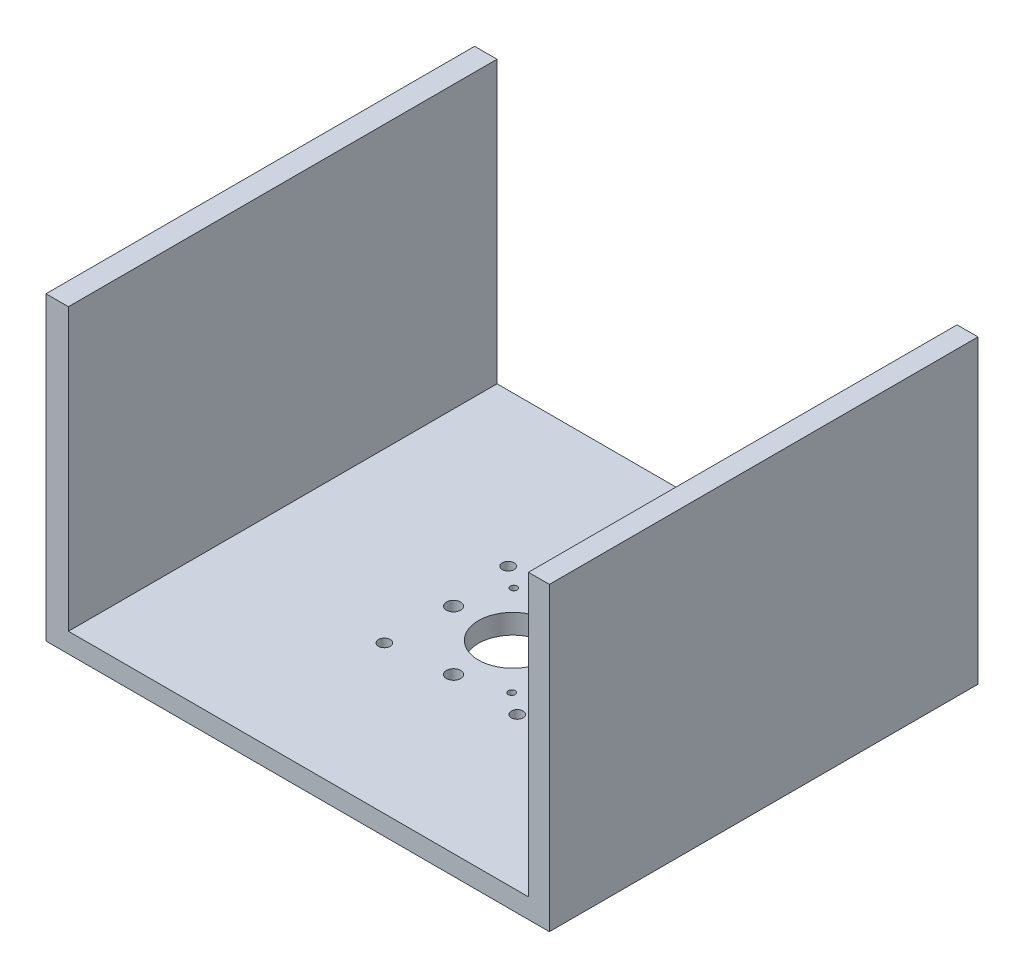
ISO-10303-21;
HEADER;
FILE_DESCRIPTION(('STEP AP214'),'2;1');
FILE_NAME('part.step','',(''),(''),'','','');
FILE_SCHEMA(('AUTOMOTIVE_DESIGN { 1 0 10303 214 1 1 1 1 }'));
ENDSEC;
DATA;
#1=APPLICATION_CONTEXT('core data for automotive mechanical design processes');
#2=APPLICATION_PROTOCOL_DEFINITION('international standard','automotive_design',2000,#1);
#3=PRODUCT_CONTEXT('',#1,'mechanical');
#4=PRODUCT('Part','Part','',(#3));
#5=PRODUCT_RELATED_PRODUCT_CATEGORY('part','',(#4));
#6=PRODUCT_DEFINITION_FORMATION('','',#4);
#7=PRODUCT_DEFINITION_CONTEXT('part definition',#1,'design');
#8=PRODUCT_DEFINITION('design','',#6,#7);
#9=PRODUCT_DEFINITION_SHAPE('','',#8);
#10=(LENGTH_UNIT() NAMED_UNIT(*) SI_UNIT(.MILLI.,.METRE.));
#11=(NAMED_UNIT(*) PLANE_ANGLE_UNIT() SI_UNIT($,.RADIAN.));
#12=(NAMED_UNIT(*) SI_UNIT($,.STERADIAN.) SOLID_ANGLE_UNIT());
#13=UNCERTAINTY_MEASURE_WITH_UNIT(LENGTH_MEASURE(1.E-05),#10,'distance_accuracy_value','');
#14=(GEOMETRIC_REPRESENTATION_CONTEXT(3) GLOBAL_UNCERTAINTY_ASSIGNED_CONTEXT((#13)) GLOBAL_UNIT_ASSIGNED_CONTEXT((#10,
#11,#12)) REPRESENTATION_CONTEXT('',''));
#15=CARTESIAN_POINT('',(0.,0.,0.));
#16=DIRECTION('',(0.,0.,1.));
#17=DIRECTION('',(1.,0.,0.));
#18=AXIS2_PLACEMENT_3D('',#15,#16,#17);
#19=CARTESIAN_POINT('',(0.,76.2,-54.2873346592199));
#20=DIRECTION('',(0.,0.,1.));
#21=DIRECTION('',(1.,0.,0.));
#22=AXIS2_PLACEMENT_3D('',#19,#20,#21);
#23=PLANE('',#22);
#24=DIRECTION('',(-1.,0.,0.));
#25=VECTOR('',#24,1.);
#26=CARTESIAN_POINT('',(0.,0.,-54.2873346592199));
#27=LINE('',#26,#25);
#28=CARTESIAN_POINT('',(63.5667694033076,0.,-54.2873346592199));
#29=VERTEX_POINT('',#28);
#30=CARTESIAN_POINT('',(-63.9431332259104,0.,-54.2873346592199));
#31=VERTEX_POINT('',#30);
#32=EDGE_CURVE('E218',#29,#31,#27,.T.);
#33=ORIENTED_EDGE('',*,*,#32,.T.);
#34=DIRECTION('',(0.,-1.,0.));
#35=VECTOR('',#34,1.);
#36=CARTESIAN_POINT('',(-63.9431332259104,76.2,-54.2873346592199));
#37=LINE('',#36,#35);
#38=CARTESIAN_POINT('',(-63.9431332259104,76.2,-54.2873346592199));
#39=VERTEX_POINT('',#38);
#40=EDGE_CURVE('E11',#39,#31,#37,.T.);
#41=ORIENTED_EDGE('',*,*,#40,.F.);
#42=DIRECTION('',(-1.,0.,0.));
#43=VECTOR('',#42,1.);
#44=CARTESIAN_POINT('',(0.,76.2,-54.2873346592199));
#45=LINE('',#44,#43);
#46=CARTESIAN_POINT('',(-58.259578658675,76.2,-54.2873346592199));
#47=VERTEX_POINT('',#46);
#48=EDGE_CURVE('E261',#47,#39,#45,.T.);
#49=ORIENTED_EDGE('',*,*,#48,.F.);
#50=DIRECTION('',(0.,-1.,0.));
#51=VECTOR('',#50,1.);
#52=CARTESIAN_POINT('',(-58.259578658675,76.2,-54.2873346592199));
#53=LINE('',#52,#51);
#54=CARTESIAN_POINT('',(-58.259578658675,5.00000000000003,-54.2873346592199));
#55=VERTEX_POINT('',#54);
#56=EDGE_CURVE('E272',#47,#55,#53,.T.);
#57=ORIENTED_EDGE('',*,*,#56,.T.);
#58=DIRECTION('',(1.,0.,0.));
#59=VECTOR('',#58,1.);
#60=CARTESIAN_POINT('',(0.,5.,-54.2873346592199));
#61=LINE('',#60,#59);
#62=CARTESIAN_POINT('',(58.259578658675,5.,-54.2873346592199));
#63=VERTEX_POINT('',#62);
#64=EDGE_CURVE('E56',#55,#63,#61,.T.);
#65=ORIENTED_EDGE('',*,*,#64,.T.);
#66=DIRECTION('',(0.,-1.,0.));
#67=VECTOR('',#66,1.);
#68=CARTESIAN_POINT('',(58.259578658675,76.2,-54.2873346592199));
#69=LINE('',#68,#67);
#70=CARTESIAN_POINT('',(58.259578658675,76.2,-54.2873346592199));
#71=VERTEX_POINT('',#70);
#72=EDGE_CURVE('E129',#71,#63,#69,.T.);
#73=ORIENTED_EDGE('',*,*,#72,.F.);
#74=DIRECTION('',(1.,0.,0.));
#75=VECTOR('',#74,1.);
#76=CARTESIAN_POINT('',(0.,76.2,-54.2873346592199));
#77=LINE('',#76,#75);
#78=CARTESIAN_POINT('',(63.5667694033076,76.2,-54.2873346592199));
#79=VERTEX_POINT('',#78);
#80=EDGE_CURVE('E135',#71,#79,#77,.T.);
#81=ORIENTED_EDGE('',*,*,#80,.T.);
#82=DIRECTION('',(0.,-1.,0.));
#83=VECTOR('',#82,1.);
#84=CARTESIAN_POINT('',(63.5667694033076,76.2,-54.2873346592199));
#85=LINE('',#84,#83);
#86=EDGE_CURVE('E117',#79,#29,#85,.T.);
#87=ORIENTED_EDGE('',*,*,#86,.T.);
#88=EDGE_LOOP('',(#33,#41,#49,#57,#65,#73,#81,#87));
#89=FACE_BOUND('',#88,.T.);
#90=ADVANCED_FACE('F41',(#89),#23,.F.);
#91=CARTESIAN_POINT('',(-63.9431332259104,76.2,0.));
#92=DIRECTION('',(1.,0.,0.));
#93=DIRECTION('',(0.,0.,-1.));
#94=AXIS2_PLACEMENT_3D('',#91,#92,#93);
#95=PLANE('',#94);
#96=DIRECTION('',(0.,0.,1.));
#97=VECTOR('',#96,1.);
#98=CARTESIAN_POINT('',(-63.9431332259104,0.,0.));
#99=LINE('',#98,#97);
#100=CARTESIAN_POINT('',(-63.9431332259104,0.,54.2873346592199));
#101=VERTEX_POINT('',#100);
#102=EDGE_CURVE('E275',#31,#101,#99,.T.);
#103=ORIENTED_EDGE('',*,*,#102,.T.);
#104=DIRECTION('',(0.,-1.,0.));
#105=VECTOR('',#104,1.);
#106=CARTESIAN_POINT('',(-63.9431332259104,76.2,54.2873346592199));
#107=LINE('',#106,#105);
#108=CARTESIAN_POINT('',(-63.9431332259104,76.2,54.2873346592199));
#109=VERTEX_POINT('',#108);
#110=EDGE_CURVE('E49',#109,#101,#107,.T.);
#111=ORIENTED_EDGE('',*,*,#110,.F.);
#112=DIRECTION('',(0.,0.,1.));
#113=VECTOR('',#112,1.);
#114=CARTESIAN_POINT('',(-63.9431332259104,76.2,0.));
#115=LINE('',#114,#113);
#116=EDGE_CURVE('E87',#39,#109,#115,.T.);
#117=ORIENTED_EDGE('',*,*,#116,.F.);
#118=ORIENTED_EDGE('',*,*,#40,.T.);
#119=EDGE_LOOP('',(#103,#111,#117,#118));
#120=FACE_BOUND('',#119,.T.);
#121=ADVANCED_FACE('F311',(#120),#95,.F.);
#122=CARTESIAN_POINT('',(0.,76.2,54.2873346592199));
#123=DIRECTION('',(0.,0.,1.));
#124=DIRECTION('',(1.,0.,0.));
#125=AXIS2_PLACEMENT_3D('',#122,#123,#124);
#126=PLANE('',#125);
#127=DIRECTION('',(-1.,0.,0.));
#128=VECTOR('',#127,1.);
#129=CARTESIAN_POINT('',(0.,0.,54.2873346592199));
#130=LINE('',#129,#128);
#131=CARTESIAN_POINT('',(63.5667694033076,0.,54.2873346592199));
#132=VERTEX_POINT('',#131);
#133=EDGE_CURVE('E264',#132,#101,#130,.T.);
#134=ORIENTED_EDGE('',*,*,#133,.F.);
#135=DIRECTION('',(0.,-1.,0.));
#136=VECTOR('',#135,1.);
#137=CARTESIAN_POINT('',(63.5667694033076,76.2,54.2873346592199));
#138=LINE('',#137,#136);
#139=CARTESIAN_POINT('',(63.5667694033076,76.2,54.2873346592199));
#140=VERTEX_POINT('',#139);
#141=EDGE_CURVE('E150',#140,#132,#138,.T.);
#142=ORIENTED_EDGE('',*,*,#141,.F.);
#143=DIRECTION('',(1.,0.,0.));
#144=VECTOR('',#143,1.);
#145=CARTESIAN_POINT('',(0.,76.2,54.2873346592199));
#146=LINE('',#145,#144);
#147=CARTESIAN_POINT('',(58.259578658675,76.2,54.2873346592199));
#148=VERTEX_POINT('',#147);
#149=EDGE_CURVE('E138',#148,#140,#146,.T.);
#150=ORIENTED_EDGE('',*,*,#149,.F.);
#151=DIRECTION('',(0.,-1.,0.));
#152=VECTOR('',#151,1.);
#153=CARTESIAN_POINT('',(58.259578658675,76.2,54.2873346592199));
#154=LINE('',#153,#152);
#155=CARTESIAN_POINT('',(58.259578658675,5.00000000000003,54.2873346592199));
#156=VERTEX_POINT('',#155);
#157=EDGE_CURVE('E155',#148,#156,#154,.T.);
#158=ORIENTED_EDGE('',*,*,#157,.T.);
#159=DIRECTION('',(1.,0.,0.));
#160=VECTOR('',#159,1.);
#161=CARTESIAN_POINT('',(0.,5.,54.2873346592199));
#162=LINE('',#161,#160);
#163=CARTESIAN_POINT('',(-58.259578658675,5.,54.2873346592199));
#164=VERTEX_POINT('',#163);
#165=EDGE_CURVE('E206',#164,#156,#162,.T.);
#166=ORIENTED_EDGE('',*,*,#165,.F.);
#167=DIRECTION('',(0.,-1.,0.));
#168=VECTOR('',#167,1.);
#169=CARTESIAN_POINT('',(-58.259578658675,76.2,54.2873346592199));
#170=LINE('',#169,#168);
#171=CARTESIAN_POINT('',(-58.259578658675,76.2,54.2873346592199));
#172=VERTEX_POINT('',#171);
#173=EDGE_CURVE('E284',#172,#164,#170,.T.);
#174=ORIENTED_EDGE('',*,*,#173,.F.);
#175=DIRECTION('',(-1.,0.,0.));
#176=VECTOR('',#175,1.);
#177=CARTESIAN_POINT('',(0.,76.2,54.2873346592199));
#178=LINE('',#177,#176);
#179=EDGE_CURVE('E267',#172,#109,#178,.T.);
#180=ORIENTED_EDGE('',*,*,#179,.T.);
#181=ORIENTED_EDGE('',*,*,#110,.T.);
#182=EDGE_LOOP('',(#134,#142,#150,#158,#166,#174,#180,#181));
#183=FACE_BOUND('',#182,.T.);
#184=ADVANCED_FACE('F290',(#183),#126,.T.);
#185=CARTESIAN_POINT('',(-58.259578658675,76.2,0.));
#186=DIRECTION('',(-1.,0.,0.));
#187=DIRECTION('',(0.,0.,1.));
#188=AXIS2_PLACEMENT_3D('',#185,#186,#187);
#189=PLANE('',#188);
#190=ORIENTED_EDGE('',*,*,#173,.T.);
#191=DIRECTION('',(0.,0.,-1.));
#192=VECTOR('',#191,1.);
#193=CARTESIAN_POINT('',(-58.259578658675,5.,0.));
#194=LINE('',#193,#192);
#195=EDGE_CURVE('E215',#164,#55,#194,.T.);
#196=ORIENTED_EDGE('',*,*,#195,.T.);
#197=ORIENTED_EDGE('',*,*,#56,.F.);
#198=DIRECTION('',(0.,0.,-1.));
#199=VECTOR('',#198,1.);
#200=CARTESIAN_POINT('',(-58.259578658675,76.2,0.));
#201=LINE('',#200,#199);
#202=EDGE_CURVE('E65',#172,#47,#201,.T.);
#203=ORIENTED_EDGE('',*,*,#202,.F.);
#204=EDGE_LOOP('',(#190,#196,#197,#203));
#205=FACE_BOUND('',#204,.T.);
#206=ADVANCED_FACE('F289',(#205),#189,.F.);
#207=CARTESIAN_POINT('',(0.,76.2,0.));
#208=DIRECTION('',(0.,1.,0.));
#209=DIRECTION('',(0.,0.,1.));
#210=AXIS2_PLACEMENT_3D('',#207,#208,#209);
#211=PLANE('',#210);
#212=ORIENTED_EDGE('',*,*,#48,.T.);
#213=ORIENTED_EDGE('',*,*,#116,.T.);
#214=ORIENTED_EDGE('',*,*,#179,.F.);
#215=ORIENTED_EDGE('',*,*,#202,.T.);
#216=EDGE_LOOP('',(#212,#213,#214,#215));
#217=FACE_BOUND('',#216,.T.);
#218=ADVANCED_FACE('F322',(#217),#211,.T.);
#219=CARTESIAN_POINT('',(0.,0.,0.));
#220=DIRECTION('',(0.,1.,0.));
#221=DIRECTION('',(0.,0.,1.));
#222=AXIS2_PLACEMENT_3D('',#219,#220,#221);
#223=PLANE('',#222);
#224=ORIENTED_EDGE('',*,*,#32,.F.);
#225=DIRECTION('',(0.,0.,1.));
#226=VECTOR('',#225,1.);
#227=CARTESIAN_POINT('',(63.5667694033076,0.,0.));
#228=LINE('',#227,#226);
#229=EDGE_CURVE('E123',#29,#132,#228,.T.);
#230=ORIENTED_EDGE('',*,*,#229,.T.);
#231=ORIENTED_EDGE('',*,*,#133,.T.);
#232=ORIENTED_EDGE('',*,*,#102,.F.);
#233=EDGE_LOOP('',(#224,#230,#231,#232));
#234=FACE_BOUND('',#233,.T.);
#235=CARTESIAN_POINT('',(0.,0.,0.));
#236=DIRECTION('',(0.,1.,0.));
#237=DIRECTION('',(0.,0.,1.));
#238=AXIS2_PLACEMENT_3D('',#235,#236,#237);
#239=CIRCLE('',#238,8.6768437);
#240=CARTESIAN_POINT('',(0.,0.,8.67684370000001));
#241=VERTEX_POINT('',#240);
#242=EDGE_CURVE('E128',#241,#241,#239,.T.);
#243=ORIENTED_EDGE('',*,*,#242,.T.);
#244=EDGE_LOOP('',(#243));
#245=FACE_BOUND('',#244,.T.);
#246=CARTESIAN_POINT('',(11.3281003312998,0.,11.6087270139325));
#247=DIRECTION('',(0.,1.,0.));
#248=DIRECTION('',(0.,0.,1.));
#249=AXIS2_PLACEMENT_3D('',#246,#247,#248);
#250=CIRCLE('',#249,0.875);
#251=CARTESIAN_POINT('',(11.3281003312998,0.,12.4837270139325));
#252=VERTEX_POINT('',#251);
#253=EDGE_CURVE('E222',#252,#252,#250,.T.);
#254=ORIENTED_EDGE('',*,*,#253,.T.);
#255=EDGE_LOOP('',(#254));
#256=FACE_BOUND('',#255,.T.);
#257=CARTESIAN_POINT('',(-11.3281003312988,0.,-11.6087270139334));
#258=DIRECTION('',(0.,1.,0.));
#259=DIRECTION('',(0.,0.,1.));
#260=AXIS2_PLACEMENT_3D('',#257,#258,#259);
#261=CIRCLE('',#260,0.875);
#262=CARTESIAN_POINT('',(-11.3281003312988,0.,-10.7337270139334));
#263=VERTEX_POINT('',#262);
#264=EDGE_CURVE('E226',#263,#263,#261,.T.);
#265=ORIENTED_EDGE('',*,*,#264,.T.);
#266=EDGE_LOOP('',(#265));
#267=FACE_BOUND('',#266,.T.);
#268=CARTESIAN_POINT('',(-15.6865060382862,0.,16.8342991630407));
#269=DIRECTION('',(0.,1.,0.));
#270=DIRECTION('',(0.,0.,1.));
#271=AXIS2_PLACEMENT_3D('',#268,#269,#270);
#272=CIRCLE('',#271,1.5);
#273=CARTESIAN_POINT('',(-15.6865060382862,0.,18.3342991630407));
#274=VERTEX_POINT('',#273);
#275=EDGE_CURVE('E230',#274,#274,#272,.T.);
#276=ORIENTED_EDGE('',*,*,#275,.T.);
#277=EDGE_LOOP('',(#276));
#278=FACE_BOUND('',#277,.T.);
#279=CARTESIAN_POINT('',(16.8342991630425,0.,15.6865060382861));
#280=DIRECTION('',(0.,1.,0.));
#281=DIRECTION('',(0.,0.,1.));
#282=AXIS2_PLACEMENT_3D('',#279,#280,#281);
#283=CIRCLE('',#282,1.5);
#284=CARTESIAN_POINT('',(16.8342991630425,0.,17.1865060382861));
#285=VERTEX_POINT('',#284);
#286=EDGE_CURVE('E234',#285,#285,#283,.T.);
#287=ORIENTED_EDGE('',*,*,#286,.T.);
#288=EDGE_LOOP('',(#287));
#289=FACE_BOUND('',#288,.T.);
#290=CARTESIAN_POINT('',(15.6865060382879,0.,-16.8342991630426));
#291=DIRECTION('',(0.,1.,0.));
#292=DIRECTION('',(0.,0.,1.));
#293=AXIS2_PLACEMENT_3D('',#290,#291,#292);
#294=CIRCLE('',#293,1.5);
#295=CARTESIAN_POINT('',(15.6865060382879,0.,-15.3342991630426));
#296=VERTEX_POINT('',#295);
#297=EDGE_CURVE('E238',#296,#296,#294,.T.);
#298=ORIENTED_EDGE('',*,*,#297,.T.);
#299=EDGE_LOOP('',(#298));
#300=FACE_BOUND('',#299,.T.);
#301=CARTESIAN_POINT('',(-16.8342991630408,0.,-15.686506038288));
#302=DIRECTION('',(0.,1.,0.));
#303=DIRECTION('',(0.,0.,1.));
#304=AXIS2_PLACEMENT_3D('',#301,#302,#303);
#305=CIRCLE('',#304,1.5);
#306=CARTESIAN_POINT('',(-16.8342991630408,0.,-14.186506038288));
#307=VERTEX_POINT('',#306);
#308=EDGE_CURVE('E242',#307,#307,#305,.T.);
#309=ORIENTED_EDGE('',*,*,#308,.T.);
#310=EDGE_LOOP('',(#309));
#311=FACE_BOUND('',#310,.T.);
#312=CARTESIAN_POINT('',(-14.9999999999992,0.,8.43789235357268E-13));
#313=DIRECTION('',(0.,1.,0.));
#314=DIRECTION('',(0.,0.,1.));
#315=AXIS2_PLACEMENT_3D('',#312,#313,#314);
#316=CIRCLE('',#315,1.8);
#317=CARTESIAN_POINT('',(-14.9999999999992,0.,1.80000000000084));
#318=VERTEX_POINT('',#317);
#319=EDGE_CURVE('E246',#318,#318,#316,.T.);
#320=ORIENTED_EDGE('',*,*,#319,.T.);
#321=EDGE_LOOP('',(#320));
#322=FACE_BOUND('',#321,.T.);
#323=CARTESIAN_POINT('',(1.69511304627905E-12,0.,15.));
#324=DIRECTION('',(0.,1.,0.));
#325=DIRECTION('',(0.,0.,1.));
#326=AXIS2_PLACEMENT_3D('',#323,#324,#325);
#327=CIRCLE('',#326,1.8);
#328=CARTESIAN_POINT('',(1.69511304627905E-12,0.,16.8));
#329=VERTEX_POINT('',#328);
#330=EDGE_CURVE('E250',#329,#329,#327,.T.);
#331=ORIENTED_EDGE('',*,*,#330,.T.);
#332=EDGE_LOOP('',(#331));
#333=FACE_BOUND('',#332,.T.);
#334=CARTESIAN_POINT('',(15.0000000000009,0.,-8.41952265158547E-13));
#335=DIRECTION('',(0.,1.,0.));
#336=DIRECTION('',(0.,0.,1.));
#337=AXIS2_PLACEMENT_3D('',#334,#335,#336);
#338=CIRCLE('',#337,1.8);
#339=CARTESIAN_POINT('',(15.0000000000009,0.,1.79999999999916));
#340=VERTEX_POINT('',#339);
#341=EDGE_CURVE('E254',#340,#340,#338,.T.);
#342=ORIENTED_EDGE('',*,*,#341,.T.);
#343=EDGE_LOOP('',(#342));
#344=FACE_BOUND('',#343,.T.);
#345=CARTESIAN_POINT('',(0.,0.,-15.));
#346=DIRECTION('',(0.,1.,0.));
#347=DIRECTION('',(0.,0.,1.));
#348=AXIS2_PLACEMENT_3D('',#345,#346,#347);
#349=CIRCLE('',#348,1.8);
#350=CARTESIAN_POINT('',(0.,0.,-13.2));
#351=VERTEX_POINT('',#350);
#352=EDGE_CURVE('E166',#351,#351,#349,.T.);
#353=ORIENTED_EDGE('',*,*,#352,.T.);
#354=EDGE_LOOP('',(#353));
#355=FACE_BOUND('',#354,.T.);
#356=ADVANCED_FACE('F323',(#234,#245,#256,#267,#278,#289,#300,#311,#322,#333,#344,#355),#223,.F.);
#357=CARTESIAN_POINT('',(0.,5.,-15.));
#358=DIRECTION('',(0.,-1.,0.));
#359=DIRECTION('',(0.,0.,-1.));
#360=AXIS2_PLACEMENT_3D('',#357,#358,#359);
#361=CYLINDRICAL_SURFACE('',#360,1.8);
#362=CARTESIAN_POINT('',(0.,5.,-15.));
#363=DIRECTION('',(0.,1.,0.));
#364=DIRECTION('',(0.,0.,1.));
#365=AXIS2_PLACEMENT_3D('',#362,#363,#364);
#366=CIRCLE('',#365,1.8);
#367=CARTESIAN_POINT('',(0.,5.,-13.2));
#368=VERTEX_POINT('',#367);
#369=EDGE_CURVE('E202',#368,#368,#366,.T.);
#370=ORIENTED_EDGE('',*,*,#369,.T.);
#371=EDGE_LOOP('',(#370));
#372=FACE_BOUND('',#371,.T.);
#373=ORIENTED_EDGE('',*,*,#352,.F.);
#374=EDGE_LOOP('',(#373));
#375=FACE_BOUND('',#374,.T.);
#376=ADVANCED_FACE('F326',(#372,#375),#361,.F.);
#377=CARTESIAN_POINT('',(15.0000000000009,5.,-8.41952265158547E-13));
#378=DIRECTION('',(0.,-1.,0.));
#379=DIRECTION('',(0.,0.,-1.));
#380=AXIS2_PLACEMENT_3D('',#377,#378,#379);
#381=CYLINDRICAL_SURFACE('',#380,1.8);
#382=CARTESIAN_POINT('',(15.0000000000009,5.,-8.41952265158547E-13));
#383=DIRECTION('',(0.,1.,0.));
#384=DIRECTION('',(0.,0.,1.));
#385=AXIS2_PLACEMENT_3D('',#382,#383,#384);
#386=CIRCLE('',#385,1.8);
#387=CARTESIAN_POINT('',(15.0000000000009,5.,1.79999999999916));
#388=VERTEX_POINT('',#387);
#389=EDGE_CURVE('E198',#388,#388,#386,.T.);
#390=ORIENTED_EDGE('',*,*,#389,.T.);
#391=EDGE_LOOP('',(#390));
#392=FACE_BOUND('',#391,.T.);
#393=ORIENTED_EDGE('',*,*,#341,.F.);
#394=EDGE_LOOP('',(#393));
#395=FACE_BOUND('',#394,.T.);
#396=ADVANCED_FACE('F360',(#392,#395),#381,.F.);
#397=CARTESIAN_POINT('',(1.69511304627905E-12,5.,15.));
#398=DIRECTION('',(0.,-1.,0.));
#399=DIRECTION('',(0.,0.,-1.));
#400=AXIS2_PLACEMENT_3D('',#397,#398,#399);
#401=CYLINDRICAL_SURFACE('',#400,1.8);
#402=CARTESIAN_POINT('',(1.69511304627905E-12,5.,15.));
#403=DIRECTION('',(0.,1.,0.));
#404=DIRECTION('',(0.,0.,1.));
#405=AXIS2_PLACEMENT_3D('',#402,#403,#404);
#406=CIRCLE('',#405,1.8);
#407=CARTESIAN_POINT('',(1.69511304627905E-12,5.,16.8));
#408=VERTEX_POINT('',#407);
#409=EDGE_CURVE('E194',#408,#408,#406,.T.);
#410=ORIENTED_EDGE('',*,*,#409,.T.);
#411=EDGE_LOOP('',(#410));
#412=FACE_BOUND('',#411,.T.);
#413=ORIENTED_EDGE('',*,*,#330,.F.);
#414=EDGE_LOOP('',(#413));
#415=FACE_BOUND('',#414,.T.);
#416=ADVANCED_FACE('F356',(#412,#415),#401,.F.);
#417=CARTESIAN_POINT('',(-14.9999999999992,5.,8.43789235357268E-13));
#418=DIRECTION('',(0.,-1.,0.));
#419=DIRECTION('',(0.,0.,-1.));
#420=AXIS2_PLACEMENT_3D('',#417,#418,#419);
#421=CYLINDRICAL_SURFACE('',#420,1.8);
#422=CARTESIAN_POINT('',(-14.9999999999992,5.,8.43789235357268E-13));
#423=DIRECTION('',(0.,1.,0.));
#424=DIRECTION('',(0.,0.,1.));
#425=AXIS2_PLACEMENT_3D('',#422,#423,#424);
#426=CIRCLE('',#425,1.8);
#427=CARTESIAN_POINT('',(-14.9999999999992,5.,1.80000000000084));
#428=VERTEX_POINT('',#427);
#429=EDGE_CURVE('E190',#428,#428,#426,.T.);
#430=ORIENTED_EDGE('',*,*,#429,.T.);
#431=EDGE_LOOP('',(#430));
#432=FACE_BOUND('',#431,.T.);
#433=ORIENTED_EDGE('',*,*,#319,.F.);
#434=EDGE_LOOP('',(#433));
#435=FACE_BOUND('',#434,.T.);
#436=ADVANCED_FACE('F352',(#432,#435),#421,.F.);
#437=CARTESIAN_POINT('',(-16.8342991630408,5.,-15.686506038288));
#438=DIRECTION('',(0.,-1.,0.));
#439=DIRECTION('',(0.,0.,-1.));
#440=AXIS2_PLACEMENT_3D('',#437,#438,#439);
#441=CYLINDRICAL_SURFACE('',#440,1.5);
#442=CARTESIAN_POINT('',(-16.8342991630408,5.,-15.686506038288));
#443=DIRECTION('',(0.,1.,0.));
#444=DIRECTION('',(0.,0.,1.));
#445=AXIS2_PLACEMENT_3D('',#442,#443,#444);
#446=CIRCLE('',#445,1.5);
#447=CARTESIAN_POINT('',(-16.8342991630408,5.,-14.186506038288));
#448=VERTEX_POINT('',#447);
#449=EDGE_CURVE('E186',#448,#448,#446,.T.);
#450=ORIENTED_EDGE('',*,*,#449,.T.);
#451=EDGE_LOOP('',(#450));
#452=FACE_BOUND('',#451,.T.);
#453=ORIENTED_EDGE('',*,*,#308,.F.);
#454=EDGE_LOOP('',(#453));
#455=FACE_BOUND('',#454,.T.);
#456=ADVANCED_FACE('F348',(#452,#455),#441,.F.);
#457=CARTESIAN_POINT('',(15.6865060382879,5.,-16.8342991630426));
#458=DIRECTION('',(0.,-1.,0.));
#459=DIRECTION('',(0.,0.,-1.));
#460=AXIS2_PLACEMENT_3D('',#457,#458,#459);
#461=CYLINDRICAL_SURFACE('',#460,1.5);
#462=CARTESIAN_POINT('',(15.6865060382879,5.,-16.8342991630426));
#463=DIRECTION('',(0.,1.,0.));
#464=DIRECTION('',(0.,0.,1.));
#465=AXIS2_PLACEMENT_3D('',#462,#463,#464);
#466=CIRCLE('',#465,1.5);
#467=CARTESIAN_POINT('',(15.6865060382879,5.,-15.3342991630426));
#468=VERTEX_POINT('',#467);
#469=EDGE_CURVE('E182',#468,#468,#466,.T.);
#470=ORIENTED_EDGE('',*,*,#469,.T.);
#471=EDGE_LOOP('',(#470));
#472=FACE_BOUND('',#471,.T.);
#473=ORIENTED_EDGE('',*,*,#297,.F.);
#474=EDGE_LOOP('',(#473));
#475=FACE_BOUND('',#474,.T.);
#476=ADVANCED_FACE('F344',(#472,#475),#461,.F.);
#477=CARTESIAN_POINT('',(16.8342991630425,5.,15.6865060382861));
#478=DIRECTION('',(0.,-1.,0.));
#479=DIRECTION('',(0.,0.,-1.));
#480=AXIS2_PLACEMENT_3D('',#477,#478,#479);
#481=CYLINDRICAL_SURFACE('',#480,1.5);
#482=CARTESIAN_POINT('',(16.8342991630425,5.,15.6865060382861));
#483=DIRECTION('',(0.,1.,0.));
#484=DIRECTION('',(0.,0.,1.));
#485=AXIS2_PLACEMENT_3D('',#482,#483,#484);
#486=CIRCLE('',#485,1.5);
#487=CARTESIAN_POINT('',(16.8342991630425,5.,17.1865060382861));
#488=VERTEX_POINT('',#487);
#489=EDGE_CURVE('E178',#488,#488,#486,.T.);
#490=ORIENTED_EDGE('',*,*,#489,.T.);
#491=EDGE_LOOP('',(#490));
#492=FACE_BOUND('',#491,.T.);
#493=ORIENTED_EDGE('',*,*,#286,.F.);
#494=EDGE_LOOP('',(#493));
#495=FACE_BOUND('',#494,.T.);
#496=ADVANCED_FACE('F340',(#492,#495),#481,.F.);
#497=CARTESIAN_POINT('',(-15.6865060382862,5.,16.8342991630407));
#498=DIRECTION('',(0.,-1.,0.));
#499=DIRECTION('',(0.,0.,-1.));
#500=AXIS2_PLACEMENT_3D('',#497,#498,#499);
#501=CYLINDRICAL_SURFACE('',#500,1.5);
#502=CARTESIAN_POINT('',(-15.6865060382862,5.,16.8342991630407));
#503=DIRECTION('',(0.,1.,0.));
#504=DIRECTION('',(0.,0.,1.));
#505=AXIS2_PLACEMENT_3D('',#502,#503,#504);
#506=CIRCLE('',#505,1.5);
#507=CARTESIAN_POINT('',(-15.6865060382862,5.,18.3342991630407));
#508=VERTEX_POINT('',#507);
#509=EDGE_CURVE('E174',#508,#508,#506,.T.);
#510=ORIENTED_EDGE('',*,*,#509,.T.);
#511=EDGE_LOOP('',(#510));
#512=FACE_BOUND('',#511,.T.);
#513=ORIENTED_EDGE('',*,*,#275,.F.);
#514=EDGE_LOOP('',(#513));
#515=FACE_BOUND('',#514,.T.);
#516=ADVANCED_FACE('F336',(#512,#515),#501,.F.);
#517=CARTESIAN_POINT('',(-11.3281003312988,5.,-11.6087270139334));
#518=DIRECTION('',(0.,-1.,0.));
#519=DIRECTION('',(0.,0.,-1.));
#520=AXIS2_PLACEMENT_3D('',#517,#518,#519);
#521=CYLINDRICAL_SURFACE('',#520,0.875);
#522=CARTESIAN_POINT('',(-11.3281003312988,5.,-11.6087270139334));
#523=DIRECTION('',(0.,1.,0.));
#524=DIRECTION('',(0.,0.,1.));
#525=AXIS2_PLACEMENT_3D('',#522,#523,#524);
#526=CIRCLE('',#525,0.875);
#527=CARTESIAN_POINT('',(-11.3281003312988,5.,-10.7337270139334));
#528=VERTEX_POINT('',#527);
#529=EDGE_CURVE('E170',#528,#528,#526,.T.);
#530=ORIENTED_EDGE('',*,*,#529,.T.);
#531=EDGE_LOOP('',(#530));
#532=FACE_BOUND('',#531,.T.);
#533=ORIENTED_EDGE('',*,*,#264,.F.);
#534=EDGE_LOOP('',(#533));
#535=FACE_BOUND('',#534,.T.);
#536=ADVANCED_FACE('F332',(#532,#535),#521,.F.);
#537=CARTESIAN_POINT('',(11.3281003312998,5.,11.6087270139325));
#538=DIRECTION('',(0.,-1.,0.));
#539=DIRECTION('',(0.,0.,-1.));
#540=AXIS2_PLACEMENT_3D('',#537,#538,#539);
#541=CYLINDRICAL_SURFACE('',#540,0.875);
#542=CARTESIAN_POINT('',(11.3281003312998,5.,11.6087270139325));
#543=DIRECTION('',(0.,1.,0.));
#544=DIRECTION('',(0.,0.,1.));
#545=AXIS2_PLACEMENT_3D('',#542,#543,#544);
#546=CIRCLE('',#545,0.875);
#547=CARTESIAN_POINT('',(11.3281003312998,5.,12.4837270139325));
#548=VERTEX_POINT('',#547);
#549=EDGE_CURVE('E165',#548,#548,#546,.T.);
#550=ORIENTED_EDGE('',*,*,#549,.T.);
#551=EDGE_LOOP('',(#550));
#552=FACE_BOUND('',#551,.T.);
#553=ORIENTED_EDGE('',*,*,#253,.F.);
#554=EDGE_LOOP('',(#553));
#555=FACE_BOUND('',#554,.T.);
#556=ADVANCED_FACE('F303',(#552,#555),#541,.F.);
#557=CARTESIAN_POINT('',(0.,5.,0.));
#558=DIRECTION('',(0.,-1.,0.));
#559=DIRECTION('',(0.,0.,-1.));
#560=AXIS2_PLACEMENT_3D('',#557,#558,#559);
#561=CYLINDRICAL_SURFACE('',#560,8.6768437);
#562=CARTESIAN_POINT('',(0.,5.,0.));
#563=DIRECTION('',(0.,1.,0.));
#564=DIRECTION('',(0.,0.,1.));
#565=AXIS2_PLACEMENT_3D('',#562,#563,#564);
#566=CIRCLE('',#565,8.6768437);
#567=CARTESIAN_POINT('',(0.,5.,8.67684370000001));
#568=VERTEX_POINT('',#567);
#569=EDGE_CURVE('E161',#568,#568,#566,.T.);
#570=ORIENTED_EDGE('',*,*,#569,.T.);
#571=EDGE_LOOP('',(#570));
#572=FACE_BOUND('',#571,.T.);
#573=ORIENTED_EDGE('',*,*,#242,.F.);
#574=EDGE_LOOP('',(#573));
#575=FACE_BOUND('',#574,.T.);
#576=ADVANCED_FACE('F294',(#572,#575),#561,.F.);
#577=CARTESIAN_POINT('',(0.,5.,0.));
#578=DIRECTION('',(0.,1.,0.));
#579=DIRECTION('',(0.,0.,1.));
#580=AXIS2_PLACEMENT_3D('',#577,#578,#579);
#581=PLANE('',#580);
#582=ORIENTED_EDGE('',*,*,#569,.F.);
#583=EDGE_LOOP('',(#582));
#584=FACE_BOUND('',#583,.T.);
#585=ORIENTED_EDGE('',*,*,#549,.F.);
#586=EDGE_LOOP('',(#585));
#587=FACE_BOUND('',#586,.T.);
#588=ORIENTED_EDGE('',*,*,#529,.F.);
#589=EDGE_LOOP('',(#588));
#590=FACE_BOUND('',#589,.T.);
#591=ORIENTED_EDGE('',*,*,#509,.F.);
#592=EDGE_LOOP('',(#591));
#593=FACE_BOUND('',#592,.T.);
#594=ORIENTED_EDGE('',*,*,#489,.F.);
#595=EDGE_LOOP('',(#594));
#596=FACE_BOUND('',#595,.T.);
#597=ORIENTED_EDGE('',*,*,#469,.F.);
#598=EDGE_LOOP('',(#597));
#599=FACE_BOUND('',#598,.T.);
#600=ORIENTED_EDGE('',*,*,#449,.F.);
#601=EDGE_LOOP('',(#600));
#602=FACE_BOUND('',#601,.T.);
#603=ORIENTED_EDGE('',*,*,#429,.F.);
#604=EDGE_LOOP('',(#603));
#605=FACE_BOUND('',#604,.T.);
#606=ORIENTED_EDGE('',*,*,#409,.F.);
#607=EDGE_LOOP('',(#606));
#608=FACE_BOUND('',#607,.T.);
#609=ORIENTED_EDGE('',*,*,#389,.F.);
#610=EDGE_LOOP('',(#609));
#611=FACE_BOUND('',#610,.T.);
#612=ORIENTED_EDGE('',*,*,#369,.F.);
#613=EDGE_LOOP('',(#612));
#614=FACE_BOUND('',#613,.T.);
#615=ORIENTED_EDGE('',*,*,#165,.T.);
#616=DIRECTION('',(0.,0.,-1.));
#617=VECTOR('',#616,1.);
#618=CARTESIAN_POINT('',(58.259578658675,5.,0.));
#619=LINE('',#618,#617);
#620=EDGE_CURVE('E210',#156,#63,#619,.T.);
#621=ORIENTED_EDGE('',*,*,#620,.T.);
#622=ORIENTED_EDGE('',*,*,#64,.F.);
#623=ORIENTED_EDGE('',*,*,#195,.F.);
#624=EDGE_LOOP('',(#615,#621,#622,#623));
#625=FACE_BOUND('',#624,.T.);
#626=ADVANCED_FACE('F291',(#584,#587,#590,#593,#596,#599,#602,#605,#608,#611,#614,#625),#581,.T.);
#627=CARTESIAN_POINT('',(58.259578658675,76.2,0.));
#628=DIRECTION('',(-1.,0.,0.));
#629=DIRECTION('',(0.,0.,1.));
#630=AXIS2_PLACEMENT_3D('',#627,#628,#629);
#631=PLANE('',#630);
#632=ORIENTED_EDGE('',*,*,#620,.F.);
#633=ORIENTED_EDGE('',*,*,#157,.F.);
#634=DIRECTION('',(0.,0.,-1.));
#635=VECTOR('',#634,1.);
#636=CARTESIAN_POINT('',(58.259578658675,76.2,0.));
#637=LINE('',#636,#635);
#638=EDGE_CURVE('E143',#148,#71,#637,.T.);
#639=ORIENTED_EDGE('',*,*,#638,.T.);
#640=ORIENTED_EDGE('',*,*,#72,.T.);
#641=EDGE_LOOP('',(#632,#633,#639,#640));
#642=FACE_BOUND('',#641,.T.);
#643=ADVANCED_FACE('F293',(#642),#631,.T.);
#644=CARTESIAN_POINT('',(63.5667694033076,76.2,0.));
#645=DIRECTION('',(1.,0.,0.));
#646=DIRECTION('',(0.,0.,-1.));
#647=AXIS2_PLACEMENT_3D('',#644,#645,#646);
#648=PLANE('',#647);
#649=ORIENTED_EDGE('',*,*,#229,.F.);
#650=ORIENTED_EDGE('',*,*,#86,.F.);
#651=DIRECTION('',(0.,0.,1.));
#652=VECTOR('',#651,1.);
#653=CARTESIAN_POINT('',(63.5667694033076,76.2,0.));
#654=LINE('',#653,#652);
#655=EDGE_CURVE('E121',#79,#140,#654,.T.);
#656=ORIENTED_EDGE('',*,*,#655,.T.);
#657=ORIENTED_EDGE('',*,*,#141,.T.);
#658=EDGE_LOOP('',(#649,#650,#656,#657));
#659=FACE_BOUND('',#658,.T.);
#660=ADVANCED_FACE('F119',(#659),#648,.T.);
#661=CARTESIAN_POINT('',(0.,76.2,0.));
#662=DIRECTION('',(0.,1.,0.));
#663=DIRECTION('',(0.,0.,1.));
#664=AXIS2_PLACEMENT_3D('',#661,#662,#663);
#665=PLANE('',#664);
#666=ORIENTED_EDGE('',*,*,#655,.F.);
#667=ORIENTED_EDGE('',*,*,#80,.F.);
#668=ORIENTED_EDGE('',*,*,#638,.F.);
#669=ORIENTED_EDGE('',*,*,#149,.T.);
#670=EDGE_LOOP('',(#666,#667,#668,#669));
#671=FACE_BOUND('',#670,.T.);
#672=ADVANCED_FACE('F133',(#671),#665,.T.);
#673=CLOSED_SHELL('',(#90,#121,#184,#206,#218,#356,#376,#396,#416,#436,#456,#476,#496,#516,#536,
#556,#576,#626,#643,#660,#672));
#674=MANIFOLD_SOLID_BREP('B2',#673);
#675=ADVANCED_BREP_SHAPE_REPRESENTATION('',(#18,#674),#14);
#676=SHAPE_DEFINITION_REPRESENTATION(#9,#675);
ENDSEC;
END-ISO-10303-21;
